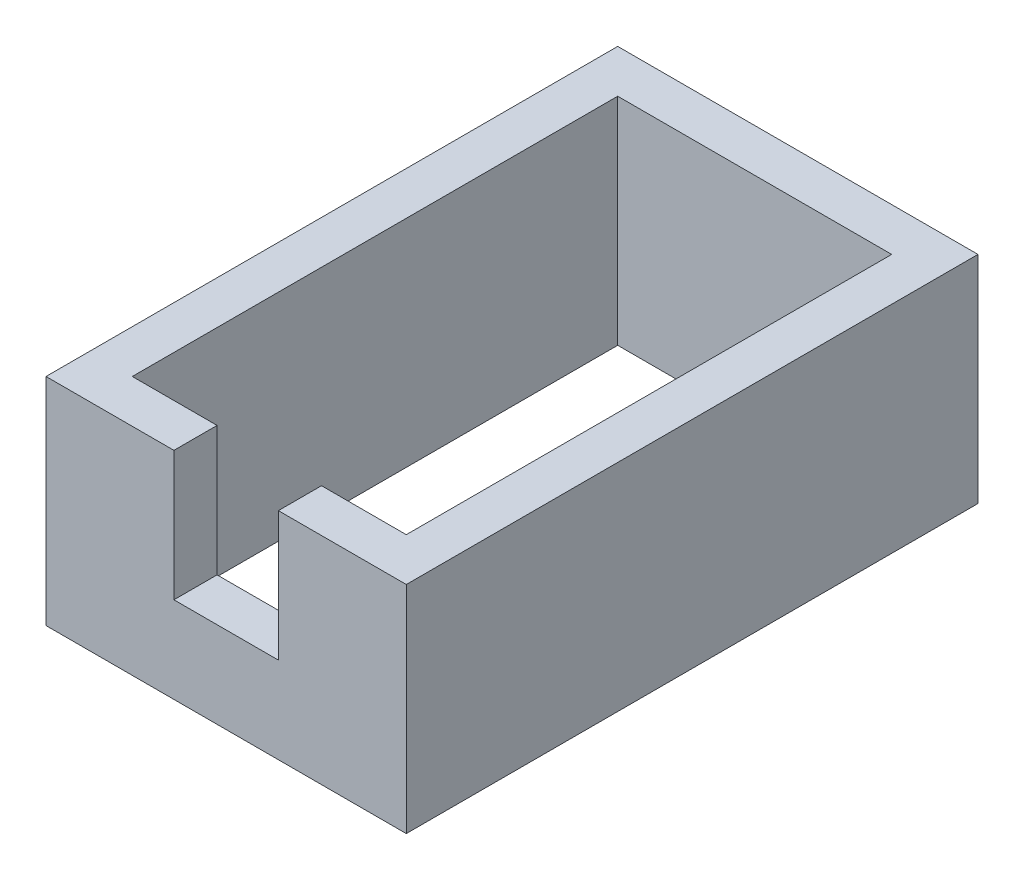
ISO-10303-21;
HEADER;
FILE_DESCRIPTION(('STEP AP214'),'2;1');
FILE_NAME('part.step','',(''),(''),'','','');
FILE_SCHEMA(('AUTOMOTIVE_DESIGN { 1 0 10303 214 1 1 1 1 }'));
ENDSEC;
DATA;
#1=APPLICATION_CONTEXT('core data for automotive mechanical design processes');
#2=APPLICATION_PROTOCOL_DEFINITION('international standard','automotive_design',2000,#1);
#3=PRODUCT_CONTEXT('',#1,'mechanical');
#4=PRODUCT('Part','Part','',(#3));
#5=PRODUCT_RELATED_PRODUCT_CATEGORY('part','',(#4));
#6=PRODUCT_DEFINITION_FORMATION('','',#4);
#7=PRODUCT_DEFINITION_CONTEXT('part definition',#1,'design');
#8=PRODUCT_DEFINITION('design','',#6,#7);
#9=PRODUCT_DEFINITION_SHAPE('','',#8);
#10=(LENGTH_UNIT() NAMED_UNIT(*) SI_UNIT(.MILLI.,.METRE.));
#11=(NAMED_UNIT(*) PLANE_ANGLE_UNIT() SI_UNIT($,.RADIAN.));
#12=(NAMED_UNIT(*) SI_UNIT($,.STERADIAN.) SOLID_ANGLE_UNIT());
#13=UNCERTAINTY_MEASURE_WITH_UNIT(LENGTH_MEASURE(1.E-05),#10,'distance_accuracy_value','');
#14=(GEOMETRIC_REPRESENTATION_CONTEXT(3) GLOBAL_UNCERTAINTY_ASSIGNED_CONTEXT((#13)) GLOBAL_UNIT_ASSIGNED_CONTEXT((#10,
#11,#12)) REPRESENTATION_CONTEXT('',''));
#15=CARTESIAN_POINT('',(0.,0.,0.));
#16=DIRECTION('',(0.,0.,1.));
#17=DIRECTION('',(1.,0.,0.));
#18=AXIS2_PLACEMENT_3D('',#15,#16,#17);
#19=CARTESIAN_POINT('',(3.92924992180117,10.,0.));
#20=DIRECTION('',(1.,0.,0.));
#21=DIRECTION('',(0.,0.,-1.));
#22=AXIS2_PLACEMENT_3D('',#19,#20,#21);
#23=PLANE('',#22);
#24=DIRECTION('',(0.,0.,1.));
#25=VECTOR('',#24,1.);
#26=CARTESIAN_POINT('',(3.92924992180117,4.,0.));
#27=LINE('',#26,#25);
#28=CARTESIAN_POINT('',(3.92924992180117,4.,0.));
#29=VERTEX_POINT('',#28);
#30=CARTESIAN_POINT('',(3.92924992180117,4.,2.));
#31=VERTEX_POINT('',#30);
#32=EDGE_CURVE('E123',#29,#31,#27,.T.);
#33=ORIENTED_EDGE('',*,*,#32,.F.);
#34=DIRECTION('',(0.,-1.,0.));
#35=VECTOR('',#34,1.);
#36=CARTESIAN_POINT('',(3.92924992180117,10.,0.));
#37=LINE('',#36,#35);
#38=CARTESIAN_POINT('',(3.92924992180117,10.,0.));
#39=VERTEX_POINT('',#38);
#40=EDGE_CURVE('E11',#39,#29,#37,.T.);
#41=ORIENTED_EDGE('',*,*,#40,.F.);
#42=DIRECTION('',(0.,0.,1.));
#43=VECTOR('',#42,1.);
#44=CARTESIAN_POINT('',(3.92924992180117,10.,0.));
#45=LINE('',#44,#43);
#46=CARTESIAN_POINT('',(3.92924992180117,10.,2.));
#47=VERTEX_POINT('',#46);
#48=EDGE_CURVE('E143',#39,#47,#45,.T.);
#49=ORIENTED_EDGE('',*,*,#48,.T.);
#50=DIRECTION('',(0.,-1.,0.));
#51=VECTOR('',#50,1.);
#52=CARTESIAN_POINT('',(3.92924992180117,10.,2.));
#53=LINE('',#52,#51);
#54=EDGE_CURVE('E132',#47,#31,#53,.T.);
#55=ORIENTED_EDGE('',*,*,#54,.T.);
#56=EDGE_LOOP('',(#33,#41,#49,#55));
#57=FACE_BOUND('',#56,.T.);
#58=ADVANCED_FACE('F33',(#57),#23,.T.);
#59=CARTESIAN_POINT('',(0.,10.,0.));
#60=DIRECTION('',(-1.,0.,0.));
#61=DIRECTION('',(0.,0.,1.));
#62=AXIS2_PLACEMENT_3D('',#59,#60,#61);
#63=PLANE('',#62);
#64=DIRECTION('',(0.,0.,-1.));
#65=VECTOR('',#64,1.);
#66=CARTESIAN_POINT('',(0.,0.,0.));
#67=LINE('',#66,#65);
#68=CARTESIAN_POINT('',(0.,0.,0.));
#69=VERTEX_POINT('',#68);
#70=CARTESIAN_POINT('',(0.,0.,-22.5));
#71=VERTEX_POINT('',#70);
#72=EDGE_CURVE('E177',#69,#71,#67,.T.);
#73=ORIENTED_EDGE('',*,*,#72,.T.);
#74=DIRECTION('',(0.,-1.,0.));
#75=VECTOR('',#74,1.);
#76=CARTESIAN_POINT('',(0.,10.,-22.5));
#77=LINE('',#76,#75);
#78=CARTESIAN_POINT('',(0.,10.,-22.5));
#79=VERTEX_POINT('',#78);
#80=EDGE_CURVE('E210',#79,#71,#77,.T.);
#81=ORIENTED_EDGE('',*,*,#80,.F.);
#82=DIRECTION('',(0.,0.,-1.));
#83=VECTOR('',#82,1.);
#84=CARTESIAN_POINT('',(0.,10.,0.));
#85=LINE('',#84,#83);
#86=CARTESIAN_POINT('',(0.,10.,0.));
#87=VERTEX_POINT('',#86);
#88=EDGE_CURVE('E142',#87,#79,#85,.T.);
#89=ORIENTED_EDGE('',*,*,#88,.F.);
#90=DIRECTION('',(0.,-1.,0.));
#91=VECTOR('',#90,1.);
#92=CARTESIAN_POINT('',(0.,10.,0.));
#93=LINE('',#92,#91);
#94=EDGE_CURVE('E40',#87,#69,#93,.T.);
#95=ORIENTED_EDGE('',*,*,#94,.T.);
#96=EDGE_LOOP('',(#73,#81,#89,#95));
#97=FACE_BOUND('',#96,.T.);
#98=ADVANCED_FACE('F214',(#97),#63,.F.);
#99=CARTESIAN_POINT('',(0.,10.,-22.5));
#100=DIRECTION('',(0.,0.,-1.));
#101=DIRECTION('',(-1.,0.,0.));
#102=AXIS2_PLACEMENT_3D('',#99,#100,#101);
#103=PLANE('',#102);
#104=DIRECTION('',(1.,0.,0.));
#105=VECTOR('',#104,1.);
#106=CARTESIAN_POINT('',(0.,0.,-22.5));
#107=LINE('',#106,#105);
#108=CARTESIAN_POINT('',(12.7,0.,-22.5));
#109=VERTEX_POINT('',#108);
#110=EDGE_CURVE('E179',#71,#109,#107,.T.);
#111=ORIENTED_EDGE('',*,*,#110,.T.);
#112=DIRECTION('',(0.,-1.,0.));
#113=VECTOR('',#112,1.);
#114=CARTESIAN_POINT('',(12.7,10.,-22.5));
#115=LINE('',#114,#113);
#116=CARTESIAN_POINT('',(12.7,10.,-22.5));
#117=VERTEX_POINT('',#116);
#118=EDGE_CURVE('E208',#117,#109,#115,.T.);
#119=ORIENTED_EDGE('',*,*,#118,.F.);
#120=DIRECTION('',(1.,0.,0.));
#121=VECTOR('',#120,1.);
#122=CARTESIAN_POINT('',(0.,10.,-22.5));
#123=LINE('',#122,#121);
#124=EDGE_CURVE('E146',#79,#117,#123,.T.);
#125=ORIENTED_EDGE('',*,*,#124,.F.);
#126=ORIENTED_EDGE('',*,*,#80,.T.);
#127=EDGE_LOOP('',(#111,#119,#125,#126));
#128=FACE_BOUND('',#127,.T.);
#129=ADVANCED_FACE('F222',(#128),#103,.F.);
#130=CARTESIAN_POINT('',(12.7,10.,0.));
#131=DIRECTION('',(-1.,0.,0.));
#132=DIRECTION('',(0.,0.,1.));
#133=AXIS2_PLACEMENT_3D('',#130,#131,#132);
#134=PLANE('',#133);
#135=DIRECTION('',(0.,0.,-1.));
#136=VECTOR('',#135,1.);
#137=CARTESIAN_POINT('',(12.7,0.,0.));
#138=LINE('',#137,#136);
#139=CARTESIAN_POINT('',(12.7,0.,0.));
#140=VERTEX_POINT('',#139);
#141=EDGE_CURVE('E176',#140,#109,#138,.T.);
#142=ORIENTED_EDGE('',*,*,#141,.F.);
#143=DIRECTION('',(0.,-1.,0.));
#144=VECTOR('',#143,1.);
#145=CARTESIAN_POINT('',(12.7,10.,0.));
#146=LINE('',#145,#144);
#147=CARTESIAN_POINT('',(12.7,10.,0.));
#148=VERTEX_POINT('',#147);
#149=EDGE_CURVE('E206',#148,#140,#146,.T.);
#150=ORIENTED_EDGE('',*,*,#149,.F.);
#151=DIRECTION('',(0.,0.,-1.));
#152=VECTOR('',#151,1.);
#153=CARTESIAN_POINT('',(12.7,10.,0.));
#154=LINE('',#153,#152);
#155=EDGE_CURVE('E152',#148,#117,#154,.T.);
#156=ORIENTED_EDGE('',*,*,#155,.T.);
#157=ORIENTED_EDGE('',*,*,#118,.T.);
#158=EDGE_LOOP('',(#142,#150,#156,#157));
#159=FACE_BOUND('',#158,.T.);
#160=ADVANCED_FACE('F263',(#159),#134,.T.);
#161=CARTESIAN_POINT('',(0.,10.,0.));
#162=DIRECTION('',(0.,0.,-1.));
#163=DIRECTION('',(-1.,0.,0.));
#164=AXIS2_PLACEMENT_3D('',#161,#162,#163);
#165=PLANE('',#164);
#166=DIRECTION('',(1.,0.,0.));
#167=VECTOR('',#166,1.);
#168=CARTESIAN_POINT('',(0.,0.,0.));
#169=LINE('',#168,#167);
#170=EDGE_CURVE('E172',#69,#140,#169,.T.);
#171=ORIENTED_EDGE('',*,*,#170,.F.);
#172=ORIENTED_EDGE('',*,*,#94,.F.);
#173=DIRECTION('',(1.,0.,0.));
#174=VECTOR('',#173,1.);
#175=CARTESIAN_POINT('',(0.,10.,0.));
#176=LINE('',#175,#174);
#177=EDGE_CURVE('E138',#87,#39,#176,.T.);
#178=ORIENTED_EDGE('',*,*,#177,.T.);
#179=ORIENTED_EDGE('',*,*,#40,.T.);
#180=DIRECTION('',(1.,0.,0.));
#181=VECTOR('',#180,1.);
#182=CARTESIAN_POINT('',(0.,4.,0.));
#183=LINE('',#182,#181);
#184=CARTESIAN_POINT('',(8.77075007819883,4.,0.));
#185=VERTEX_POINT('',#184);
#186=EDGE_CURVE('E119',#29,#185,#183,.T.);
#187=ORIENTED_EDGE('',*,*,#186,.T.);
#188=DIRECTION('',(0.,-1.,0.));
#189=VECTOR('',#188,1.);
#190=CARTESIAN_POINT('',(8.77075007819883,10.,0.));
#191=LINE('',#190,#189);
#192=CARTESIAN_POINT('',(8.77075007819883,10.,0.));
#193=VERTEX_POINT('',#192);
#194=EDGE_CURVE('E47',#193,#185,#191,.T.);
#195=ORIENTED_EDGE('',*,*,#194,.F.);
#196=EDGE_CURVE('E145',#193,#148,#176,.T.);
#197=ORIENTED_EDGE('',*,*,#196,.T.);
#198=ORIENTED_EDGE('',*,*,#149,.T.);
#199=EDGE_LOOP('',(#171,#172,#178,#179,#187,#195,#197,#198));
#200=FACE_BOUND('',#199,.T.);
#201=ADVANCED_FACE('F136',(#200),#165,.T.);
#202=CARTESIAN_POINT('',(8.77075007819883,10.,0.));
#203=DIRECTION('',(1.,0.,0.));
#204=DIRECTION('',(0.,0.,-1.));
#205=AXIS2_PLACEMENT_3D('',#202,#203,#204);
#206=PLANE('',#205);
#207=ORIENTED_EDGE('',*,*,#194,.T.);
#208=DIRECTION('',(0.,0.,1.));
#209=VECTOR('',#208,1.);
#210=CARTESIAN_POINT('',(8.77075007819883,4.,0.));
#211=LINE('',#210,#209);
#212=CARTESIAN_POINT('',(8.77075007819883,4.,2.));
#213=VERTEX_POINT('',#212);
#214=EDGE_CURVE('E52',#185,#213,#211,.T.);
#215=ORIENTED_EDGE('',*,*,#214,.T.);
#216=DIRECTION('',(0.,-1.,0.));
#217=VECTOR('',#216,1.);
#218=CARTESIAN_POINT('',(8.77075007819883,10.,2.));
#219=LINE('',#218,#217);
#220=CARTESIAN_POINT('',(8.77075007819883,10.,2.));
#221=VERTEX_POINT('',#220);
#222=EDGE_CURVE('E203',#221,#213,#219,.T.);
#223=ORIENTED_EDGE('',*,*,#222,.F.);
#224=DIRECTION('',(0.,0.,1.));
#225=VECTOR('',#224,1.);
#226=CARTESIAN_POINT('',(8.77075007819883,10.,0.));
#227=LINE('',#226,#225);
#228=EDGE_CURVE('E151',#193,#221,#227,.T.);
#229=ORIENTED_EDGE('',*,*,#228,.F.);
#230=EDGE_LOOP('',(#207,#215,#223,#229));
#231=FACE_BOUND('',#230,.T.);
#232=ADVANCED_FACE('F227',(#231),#206,.F.);
#233=CARTESIAN_POINT('',(14.7,10.,0.));
#234=DIRECTION('',(-1.,0.,0.));
#235=DIRECTION('',(0.,0.,1.));
#236=AXIS2_PLACEMENT_3D('',#233,#234,#235);
#237=PLANE('',#236);
#238=DIRECTION('',(0.,0.,-1.));
#239=VECTOR('',#238,1.);
#240=CARTESIAN_POINT('',(14.7,0.,0.));
#241=LINE('',#240,#239);
#242=CARTESIAN_POINT('',(14.7,0.,2.));
#243=VERTEX_POINT('',#242);
#244=CARTESIAN_POINT('',(14.7,0.,-24.5));
#245=VERTEX_POINT('',#244);
#246=EDGE_CURVE('E175',#243,#245,#241,.T.);
#247=ORIENTED_EDGE('',*,*,#246,.T.);
#248=DIRECTION('',(0.,-1.,0.));
#249=VECTOR('',#248,1.);
#250=CARTESIAN_POINT('',(14.7,10.,-24.5));
#251=LINE('',#250,#249);
#252=CARTESIAN_POINT('',(14.7,10.,-24.5));
#253=VERTEX_POINT('',#252);
#254=EDGE_CURVE('E198',#253,#245,#251,.T.);
#255=ORIENTED_EDGE('',*,*,#254,.F.);
#256=DIRECTION('',(0.,0.,-1.));
#257=VECTOR('',#256,1.);
#258=CARTESIAN_POINT('',(14.7,10.,0.));
#259=LINE('',#258,#257);
#260=CARTESIAN_POINT('',(14.7,10.,2.));
#261=VERTEX_POINT('',#260);
#262=EDGE_CURVE('E163',#261,#253,#259,.T.);
#263=ORIENTED_EDGE('',*,*,#262,.F.);
#264=DIRECTION('',(0.,-1.,0.));
#265=VECTOR('',#264,1.);
#266=CARTESIAN_POINT('',(14.7,10.,2.));
#267=LINE('',#266,#265);
#268=EDGE_CURVE('E200',#261,#243,#267,.T.);
#269=ORIENTED_EDGE('',*,*,#268,.T.);
#270=EDGE_LOOP('',(#247,#255,#263,#269));
#271=FACE_BOUND('',#270,.T.);
#272=ADVANCED_FACE('F235',(#271),#237,.F.);
#273=CARTESIAN_POINT('',(0.,10.,-24.5));
#274=DIRECTION('',(0.,0.,-1.));
#275=DIRECTION('',(-1.,0.,0.));
#276=AXIS2_PLACEMENT_3D('',#273,#274,#275);
#277=PLANE('',#276);
#278=DIRECTION('',(1.,0.,0.));
#279=VECTOR('',#278,1.);
#280=CARTESIAN_POINT('',(0.,0.,-24.5));
#281=LINE('',#280,#279);
#282=CARTESIAN_POINT('',(-2.,0.,-24.5));
#283=VERTEX_POINT('',#282);
#284=EDGE_CURVE('E188',#283,#245,#281,.T.);
#285=ORIENTED_EDGE('',*,*,#284,.F.);
#286=DIRECTION('',(0.,-1.,0.));
#287=VECTOR('',#286,1.);
#288=CARTESIAN_POINT('',(-2.,10.,-24.5));
#289=LINE('',#288,#287);
#290=CARTESIAN_POINT('',(-2.,10.,-24.5));
#291=VERTEX_POINT('',#290);
#292=EDGE_CURVE('E196',#291,#283,#289,.T.);
#293=ORIENTED_EDGE('',*,*,#292,.F.);
#294=DIRECTION('',(1.,0.,0.));
#295=VECTOR('',#294,1.);
#296=CARTESIAN_POINT('',(0.,10.,-24.5));
#297=LINE('',#296,#295);
#298=EDGE_CURVE('E166',#291,#253,#297,.T.);
#299=ORIENTED_EDGE('',*,*,#298,.T.);
#300=ORIENTED_EDGE('',*,*,#254,.T.);
#301=EDGE_LOOP('',(#285,#293,#299,#300));
#302=FACE_BOUND('',#301,.T.);
#303=ADVANCED_FACE('F247',(#302),#277,.T.);
#304=CARTESIAN_POINT('',(-2.,10.,0.));
#305=DIRECTION('',(-1.,0.,0.));
#306=DIRECTION('',(0.,0.,1.));
#307=AXIS2_PLACEMENT_3D('',#304,#305,#306);
#308=PLANE('',#307);
#309=DIRECTION('',(0.,0.,-1.));
#310=VECTOR('',#309,1.);
#311=CARTESIAN_POINT('',(-2.,0.,0.));
#312=LINE('',#311,#310);
#313=CARTESIAN_POINT('',(-2.,0.,2.));
#314=VERTEX_POINT('',#313);
#315=EDGE_CURVE('E185',#314,#283,#312,.T.);
#316=ORIENTED_EDGE('',*,*,#315,.F.);
#317=DIRECTION('',(0.,-1.,0.));
#318=VECTOR('',#317,1.);
#319=CARTESIAN_POINT('',(-2.,10.,2.));
#320=LINE('',#319,#318);
#321=CARTESIAN_POINT('',(-2.,10.,2.));
#322=VERTEX_POINT('',#321);
#323=EDGE_CURVE('E194',#322,#314,#320,.T.);
#324=ORIENTED_EDGE('',*,*,#323,.F.);
#325=DIRECTION('',(0.,0.,-1.));
#326=VECTOR('',#325,1.);
#327=CARTESIAN_POINT('',(-2.,10.,0.));
#328=LINE('',#327,#326);
#329=EDGE_CURVE('E169',#322,#291,#328,.T.);
#330=ORIENTED_EDGE('',*,*,#329,.T.);
#331=ORIENTED_EDGE('',*,*,#292,.T.);
#332=EDGE_LOOP('',(#316,#324,#330,#331));
#333=FACE_BOUND('',#332,.T.);
#334=ADVANCED_FACE('F241',(#333),#308,.T.);
#335=CARTESIAN_POINT('',(0.,10.,2.));
#336=DIRECTION('',(0.,0.,-1.));
#337=DIRECTION('',(-1.,0.,0.));
#338=AXIS2_PLACEMENT_3D('',#335,#336,#337);
#339=PLANE('',#338);
#340=DIRECTION('',(1.,0.,0.));
#341=VECTOR('',#340,1.);
#342=CARTESIAN_POINT('',(0.,0.,2.));
#343=LINE('',#342,#341);
#344=EDGE_CURVE('E148',#314,#243,#343,.T.);
#345=ORIENTED_EDGE('',*,*,#344,.T.);
#346=ORIENTED_EDGE('',*,*,#268,.F.);
#347=DIRECTION('',(1.,0.,0.));
#348=VECTOR('',#347,1.);
#349=CARTESIAN_POINT('',(0.,10.,2.));
#350=LINE('',#349,#348);
#351=EDGE_CURVE('E154',#221,#261,#350,.T.);
#352=ORIENTED_EDGE('',*,*,#351,.F.);
#353=ORIENTED_EDGE('',*,*,#222,.T.);
#354=DIRECTION('',(1.,0.,0.));
#355=VECTOR('',#354,1.);
#356=CARTESIAN_POINT('',(0.,4.,2.));
#357=LINE('',#356,#355);
#358=EDGE_CURVE('E133',#31,#213,#357,.T.);
#359=ORIENTED_EDGE('',*,*,#358,.F.);
#360=ORIENTED_EDGE('',*,*,#54,.F.);
#361=EDGE_CURVE('E164',#322,#47,#350,.T.);
#362=ORIENTED_EDGE('',*,*,#361,.F.);
#363=ORIENTED_EDGE('',*,*,#323,.T.);
#364=EDGE_LOOP('',(#345,#346,#352,#353,#359,#360,#362,#363));
#365=FACE_BOUND('',#364,.T.);
#366=ADVANCED_FACE('F229',(#365),#339,.F.);
#367=CARTESIAN_POINT('',(0.,10.,0.));
#368=DIRECTION('',(0.,1.,0.));
#369=DIRECTION('',(0.,0.,1.));
#370=AXIS2_PLACEMENT_3D('',#367,#368,#369);
#371=PLANE('',#370);
#372=ORIENTED_EDGE('',*,*,#48,.F.);
#373=ORIENTED_EDGE('',*,*,#177,.F.);
#374=ORIENTED_EDGE('',*,*,#88,.T.);
#375=ORIENTED_EDGE('',*,*,#124,.T.);
#376=ORIENTED_EDGE('',*,*,#155,.F.);
#377=ORIENTED_EDGE('',*,*,#196,.F.);
#378=ORIENTED_EDGE('',*,*,#228,.T.);
#379=ORIENTED_EDGE('',*,*,#351,.T.);
#380=ORIENTED_EDGE('',*,*,#262,.T.);
#381=ORIENTED_EDGE('',*,*,#298,.F.);
#382=ORIENTED_EDGE('',*,*,#329,.F.);
#383=ORIENTED_EDGE('',*,*,#361,.T.);
#384=EDGE_LOOP('',(#372,#373,#374,#375,#376,#377,#378,#379,#380,#381,#382,#383));
#385=FACE_BOUND('',#384,.T.);
#386=ADVANCED_FACE('F224',(#385),#371,.T.);
#387=CARTESIAN_POINT('',(0.,0.,0.));
#388=DIRECTION('',(0.,1.,0.));
#389=DIRECTION('',(0.,0.,1.));
#390=AXIS2_PLACEMENT_3D('',#387,#388,#389);
#391=PLANE('',#390);
#392=ORIENTED_EDGE('',*,*,#246,.F.);
#393=ORIENTED_EDGE('',*,*,#344,.F.);
#394=ORIENTED_EDGE('',*,*,#315,.T.);
#395=ORIENTED_EDGE('',*,*,#284,.T.);
#396=EDGE_LOOP('',(#392,#393,#394,#395));
#397=FACE_BOUND('',#396,.T.);
#398=ORIENTED_EDGE('',*,*,#72,.F.);
#399=ORIENTED_EDGE('',*,*,#170,.T.);
#400=ORIENTED_EDGE('',*,*,#141,.T.);
#401=ORIENTED_EDGE('',*,*,#110,.F.);
#402=EDGE_LOOP('',(#398,#399,#400,#401));
#403=FACE_BOUND('',#402,.T.);
#404=ADVANCED_FACE('F218',(#397,#403),#391,.F.);
#405=CARTESIAN_POINT('',(0.,4.,0.));
#406=DIRECTION('',(0.,1.,0.));
#407=DIRECTION('',(0.,0.,1.));
#408=AXIS2_PLACEMENT_3D('',#405,#406,#407);
#409=PLANE('',#408);
#410=ORIENTED_EDGE('',*,*,#186,.F.);
#411=ORIENTED_EDGE('',*,*,#32,.T.);
#412=ORIENTED_EDGE('',*,*,#358,.T.);
#413=ORIENTED_EDGE('',*,*,#214,.F.);
#414=EDGE_LOOP('',(#410,#411,#412,#413));
#415=FACE_BOUND('',#414,.T.);
#416=ADVANCED_FACE('F121',(#415),#409,.T.);
#417=CLOSED_SHELL('',(#58,#98,#129,#160,#201,#232,#272,#303,#334,#366,#386,#404,#416));
#418=MANIFOLD_SOLID_BREP('B2',#417);
#419=ADVANCED_BREP_SHAPE_REPRESENTATION('',(#18,#418),#14);
#420=SHAPE_DEFINITION_REPRESENTATION(#9,#419);
ENDSEC;
END-ISO-10303-21;
